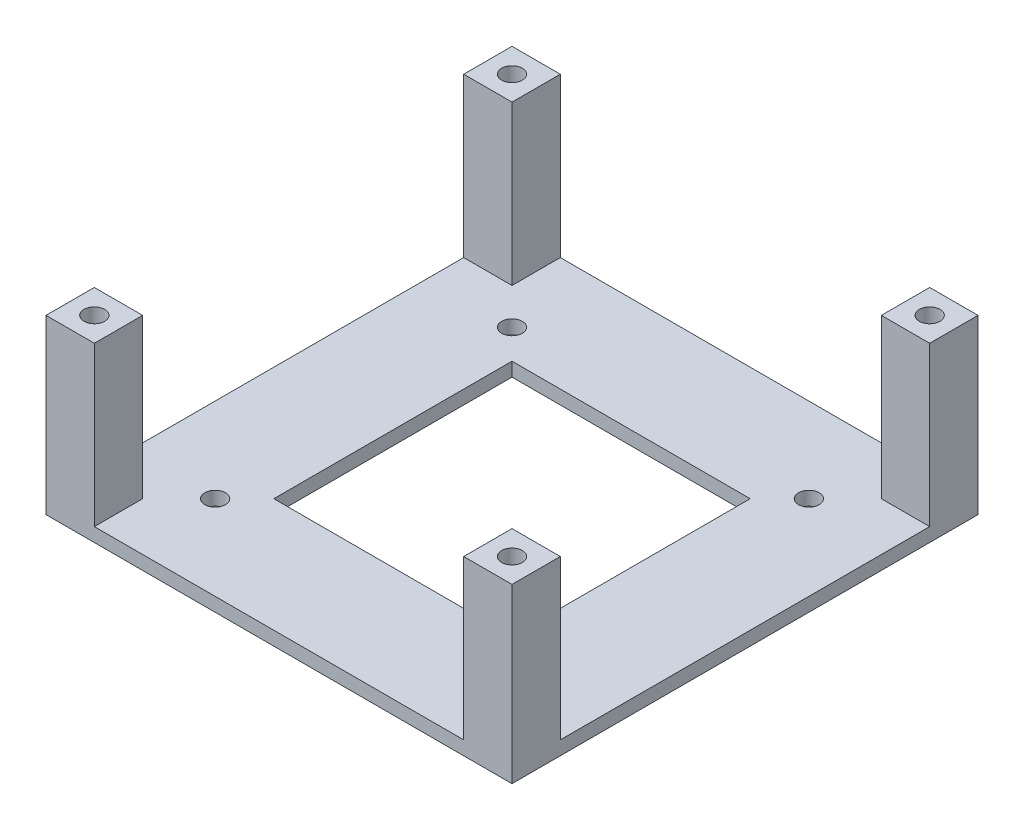
ISO-10303-21;
HEADER;
FILE_DESCRIPTION(('STEP AP214'),'2;1');
FILE_NAME('part.step','',(''),(''),'','','');
FILE_SCHEMA(('AUTOMOTIVE_DESIGN { 1 0 10303 214 1 1 1 1 }'));
ENDSEC;
DATA;
#1=APPLICATION_CONTEXT('core data for automotive mechanical design processes');
#2=APPLICATION_PROTOCOL_DEFINITION('international standard','automotive_design',2000,#1);
#3=PRODUCT_CONTEXT('',#1,'mechanical');
#4=PRODUCT('Part','Part','',(#3));
#5=PRODUCT_RELATED_PRODUCT_CATEGORY('part','',(#4));
#6=PRODUCT_DEFINITION_FORMATION('','',#4);
#7=PRODUCT_DEFINITION_CONTEXT('part definition',#1,'design');
#8=PRODUCT_DEFINITION('design','',#6,#7);
#9=PRODUCT_DEFINITION_SHAPE('','',#8);
#10=(LENGTH_UNIT() NAMED_UNIT(*) SI_UNIT(.MILLI.,.METRE.));
#11=(NAMED_UNIT(*) PLANE_ANGLE_UNIT() SI_UNIT($,.RADIAN.));
#12=(NAMED_UNIT(*) SI_UNIT($,.STERADIAN.) SOLID_ANGLE_UNIT());
#13=UNCERTAINTY_MEASURE_WITH_UNIT(LENGTH_MEASURE(1.E-05),#10,'distance_accuracy_value','');
#14=(GEOMETRIC_REPRESENTATION_CONTEXT(3) GLOBAL_UNCERTAINTY_ASSIGNED_CONTEXT((#13)) GLOBAL_UNIT_ASSIGNED_CONTEXT((#10,
#11,#12)) REPRESENTATION_CONTEXT('',''));
#15=CARTESIAN_POINT('',(0.,0.,0.));
#16=DIRECTION('',(0.,0.,1.));
#17=DIRECTION('',(1.,0.,0.));
#18=AXIS2_PLACEMENT_3D('',#15,#16,#17);
#19=CARTESIAN_POINT('',(17.25,2.,0.));
#20=DIRECTION('',(-1.,0.,0.));
#21=DIRECTION('',(0.,0.,1.));
#22=AXIS2_PLACEMENT_3D('',#19,#20,#21);
#23=PLANE('',#22);
#24=DIRECTION('',(0.,0.,-1.));
#25=VECTOR('',#24,1.);
#26=CARTESIAN_POINT('',(17.25,0.,0.));
#27=LINE('',#26,#25);
#28=CARTESIAN_POINT('',(17.25,0.,17.25));
#29=VERTEX_POINT('',#28);
#30=CARTESIAN_POINT('',(17.25,0.,-17.25));
#31=VERTEX_POINT('',#30);
#32=EDGE_CURVE('E358',#29,#31,#27,.T.);
#33=ORIENTED_EDGE('',*,*,#32,.F.);
#34=DIRECTION('',(0.,-1.,0.));
#35=VECTOR('',#34,1.);
#36=CARTESIAN_POINT('',(17.25,2.,17.25));
#37=LINE('',#36,#35);
#38=CARTESIAN_POINT('',(17.25,2.,17.25));
#39=VERTEX_POINT('',#38);
#40=EDGE_CURVE('E11',#39,#29,#37,.T.);
#41=ORIENTED_EDGE('',*,*,#40,.F.);
#42=DIRECTION('',(0.,0.,-1.));
#43=VECTOR('',#42,1.);
#44=CARTESIAN_POINT('',(17.25,2.,0.));
#45=LINE('',#44,#43);
#46=CARTESIAN_POINT('',(17.25,2.,-17.25));
#47=VERTEX_POINT('',#46);
#48=EDGE_CURVE('E335',#39,#47,#45,.T.);
#49=ORIENTED_EDGE('',*,*,#48,.T.);
#50=DIRECTION('',(0.,-1.,0.));
#51=VECTOR('',#50,1.);
#52=CARTESIAN_POINT('',(17.25,2.,-17.25));
#53=LINE('',#52,#51);
#54=EDGE_CURVE('E352',#47,#31,#53,.T.);
#55=ORIENTED_EDGE('',*,*,#54,.T.);
#56=EDGE_LOOP('',(#33,#41,#49,#55));
#57=FACE_BOUND('',#56,.T.);
#58=ADVANCED_FACE('F34',(#57),#23,.T.);
#59=CARTESIAN_POINT('',(0.,2.,17.25));
#60=DIRECTION('',(0.,0.,-1.));
#61=DIRECTION('',(-1.,0.,0.));
#62=AXIS2_PLACEMENT_3D('',#59,#60,#61);
#63=PLANE('',#62);
#64=DIRECTION('',(1.,0.,0.));
#65=VECTOR('',#64,1.);
#66=CARTESIAN_POINT('',(0.,0.,17.25));
#67=LINE('',#66,#65);
#68=CARTESIAN_POINT('',(-17.25,0.,17.25));
#69=VERTEX_POINT('',#68);
#70=EDGE_CURVE('E361',#69,#29,#67,.T.);
#71=ORIENTED_EDGE('',*,*,#70,.F.);
#72=DIRECTION('',(0.,-1.,0.));
#73=VECTOR('',#72,1.);
#74=CARTESIAN_POINT('',(-17.25,2.,17.25));
#75=LINE('',#74,#73);
#76=CARTESIAN_POINT('',(-17.25,2.,17.25));
#77=VERTEX_POINT('',#76);
#78=EDGE_CURVE('E42',#77,#69,#75,.T.);
#79=ORIENTED_EDGE('',*,*,#78,.F.);
#80=DIRECTION('',(1.,0.,0.));
#81=VECTOR('',#80,1.);
#82=CARTESIAN_POINT('',(0.,2.,17.25));
#83=LINE('',#82,#81);
#84=EDGE_CURVE('E338',#77,#39,#83,.T.);
#85=ORIENTED_EDGE('',*,*,#84,.T.);
#86=ORIENTED_EDGE('',*,*,#40,.T.);
#87=EDGE_LOOP('',(#71,#79,#85,#86));
#88=FACE_BOUND('',#87,.T.);
#89=ADVANCED_FACE('F389',(#88),#63,.T.);
#90=CARTESIAN_POINT('',(-17.25,2.,0.));
#91=DIRECTION('',(-1.,0.,0.));
#92=DIRECTION('',(0.,0.,1.));
#93=AXIS2_PLACEMENT_3D('',#90,#91,#92);
#94=PLANE('',#93);
#95=DIRECTION('',(0.,0.,-1.));
#96=VECTOR('',#95,1.);
#97=CARTESIAN_POINT('',(-17.25,0.,0.));
#98=LINE('',#97,#96);
#99=CARTESIAN_POINT('',(-17.25,0.,-17.25));
#100=VERTEX_POINT('',#99);
#101=EDGE_CURVE('E364',#69,#100,#98,.T.);
#102=ORIENTED_EDGE('',*,*,#101,.T.);
#103=DIRECTION('',(0.,-1.,0.));
#104=VECTOR('',#103,1.);
#105=CARTESIAN_POINT('',(-17.25,2.,-17.25));
#106=LINE('',#105,#104);
#107=CARTESIAN_POINT('',(-17.25,2.,-17.25));
#108=VERTEX_POINT('',#107);
#109=EDGE_CURVE('E376',#108,#100,#106,.T.);
#110=ORIENTED_EDGE('',*,*,#109,.F.);
#111=DIRECTION('',(0.,0.,-1.));
#112=VECTOR('',#111,1.);
#113=CARTESIAN_POINT('',(-17.25,2.,0.));
#114=LINE('',#113,#112);
#115=EDGE_CURVE('E341',#77,#108,#114,.T.);
#116=ORIENTED_EDGE('',*,*,#115,.F.);
#117=ORIENTED_EDGE('',*,*,#78,.T.);
#118=EDGE_LOOP('',(#102,#110,#116,#117));
#119=FACE_BOUND('',#118,.T.);
#120=ADVANCED_FACE('F381',(#119),#94,.F.);
#121=CARTESIAN_POINT('',(21.5,2.,-21.5));
#122=DIRECTION('',(0.,-1.,0.));
#123=DIRECTION('',(0.,0.,-1.));
#124=AXIS2_PLACEMENT_3D('',#121,#122,#123);
#125=CYLINDRICAL_SURFACE('',#124,1.5);
#126=CARTESIAN_POINT('',(21.5,2.,-21.5));
#127=DIRECTION('',(0.,1.,0.));
#128=DIRECTION('',(0.,0.,1.));
#129=AXIS2_PLACEMENT_3D('',#126,#127,#128);
#130=CIRCLE('',#129,1.5);
#131=CARTESIAN_POINT('',(21.5,2.,-20.));
#132=VERTEX_POINT('',#131);
#133=EDGE_CURVE('E346',#132,#132,#130,.T.);
#134=ORIENTED_EDGE('',*,*,#133,.T.);
#135=EDGE_LOOP('',(#134));
#136=FACE_BOUND('',#135,.T.);
#137=CARTESIAN_POINT('',(21.5,0.,-21.5));
#138=DIRECTION('',(0.,1.,0.));
#139=DIRECTION('',(0.,0.,1.));
#140=AXIS2_PLACEMENT_3D('',#137,#138,#139);
#141=CIRCLE('',#140,1.5);
#142=CARTESIAN_POINT('',(21.5,0.,-20.));
#143=VERTEX_POINT('',#142);
#144=EDGE_CURVE('E370',#143,#143,#141,.T.);
#145=ORIENTED_EDGE('',*,*,#144,.F.);
#146=EDGE_LOOP('',(#145));
#147=FACE_BOUND('',#146,.T.);
#148=ADVANCED_FACE('F457',(#136,#147),#125,.F.);
#149=CARTESIAN_POINT('',(0.,2.,-17.25));
#150=DIRECTION('',(0.,0.,-1.));
#151=DIRECTION('',(-1.,0.,0.));
#152=AXIS2_PLACEMENT_3D('',#149,#150,#151);
#153=PLANE('',#152);
#154=DIRECTION('',(1.,0.,0.));
#155=VECTOR('',#154,1.);
#156=CARTESIAN_POINT('',(0.,0.,-17.25));
#157=LINE('',#156,#155);
#158=EDGE_CURVE('E367',#100,#31,#157,.T.);
#159=ORIENTED_EDGE('',*,*,#158,.T.);
#160=ORIENTED_EDGE('',*,*,#54,.F.);
#161=DIRECTION('',(1.,0.,0.));
#162=VECTOR('',#161,1.);
#163=CARTESIAN_POINT('',(0.,2.,-17.25));
#164=LINE('',#163,#162);
#165=EDGE_CURVE('E344',#108,#47,#164,.T.);
#166=ORIENTED_EDGE('',*,*,#165,.F.);
#167=ORIENTED_EDGE('',*,*,#109,.T.);
#168=EDGE_LOOP('',(#159,#160,#166,#167));
#169=FACE_BOUND('',#168,.T.);
#170=ADVANCED_FACE('F395',(#169),#153,.F.);
#171=CARTESIAN_POINT('',(-21.5,2.,21.5));
#172=DIRECTION('',(0.,-1.,0.));
#173=DIRECTION('',(0.,0.,-1.));
#174=AXIS2_PLACEMENT_3D('',#171,#172,#173);
#175=CYLINDRICAL_SURFACE('',#174,1.5);
#176=CARTESIAN_POINT('',(-21.5,2.,21.5));
#177=DIRECTION('',(0.,1.,0.));
#178=DIRECTION('',(0.,0.,1.));
#179=AXIS2_PLACEMENT_3D('',#176,#177,#178);
#180=CIRCLE('',#179,1.5);
#181=CARTESIAN_POINT('',(-21.5,2.,23.));
#182=VERTEX_POINT('',#181);
#183=EDGE_CURVE('E331',#182,#182,#180,.T.);
#184=ORIENTED_EDGE('',*,*,#183,.T.);
#185=EDGE_LOOP('',(#184));
#186=FACE_BOUND('',#185,.T.);
#187=CARTESIAN_POINT('',(-21.5,0.,21.5));
#188=DIRECTION('',(0.,1.,0.));
#189=DIRECTION('',(0.,0.,1.));
#190=AXIS2_PLACEMENT_3D('',#187,#188,#189);
#191=CIRCLE('',#190,1.5);
#192=CARTESIAN_POINT('',(-21.5,0.,23.));
#193=VERTEX_POINT('',#192);
#194=EDGE_CURVE('E355',#193,#193,#191,.T.);
#195=ORIENTED_EDGE('',*,*,#194,.F.);
#196=EDGE_LOOP('',(#195));
#197=FACE_BOUND('',#196,.T.);
#198=ADVANCED_FACE('F449',(#186,#197),#175,.F.);
#199=CARTESIAN_POINT('',(21.5,2.,21.5));
#200=DIRECTION('',(0.,-1.,0.));
#201=DIRECTION('',(0.,0.,-1.));
#202=AXIS2_PLACEMENT_3D('',#199,#200,#201);
#203=CYLINDRICAL_SURFACE('',#202,1.5);
#204=CARTESIAN_POINT('',(21.5,2.,21.5));
#205=DIRECTION('',(0.,1.,0.));
#206=DIRECTION('',(0.,0.,1.));
#207=AXIS2_PLACEMENT_3D('',#204,#205,#206);
#208=CIRCLE('',#207,1.5);
#209=CARTESIAN_POINT('',(21.5,2.,23.));
#210=VERTEX_POINT('',#209);
#211=EDGE_CURVE('E328',#210,#210,#208,.F.);
#212=ORIENTED_EDGE('',*,*,#211,.F.);
#213=EDGE_LOOP('',(#212));
#214=FACE_BOUND('',#213,.T.);
#215=CARTESIAN_POINT('',(21.5,0.,21.5));
#216=DIRECTION('',(0.,1.,0.));
#217=DIRECTION('',(0.,0.,1.));
#218=AXIS2_PLACEMENT_3D('',#215,#216,#217);
#219=CIRCLE('',#218,1.5);
#220=CARTESIAN_POINT('',(21.5,0.,23.));
#221=VERTEX_POINT('',#220);
#222=EDGE_CURVE('E327',#221,#221,#219,.F.);
#223=ORIENTED_EDGE('',*,*,#222,.T.);
#224=EDGE_LOOP('',(#223));
#225=FACE_BOUND('',#224,.T.);
#226=ADVANCED_FACE('F36',(#214,#225),#203,.F.);
#227=CARTESIAN_POINT('',(-21.5,2.,-21.5));
#228=DIRECTION('',(0.,-1.,0.));
#229=DIRECTION('',(0.,0.,-1.));
#230=AXIS2_PLACEMENT_3D('',#227,#228,#229);
#231=CYLINDRICAL_SURFACE('',#230,1.5);
#232=CARTESIAN_POINT('',(-21.5,2.,-21.5));
#233=DIRECTION('',(0.,1.,0.));
#234=DIRECTION('',(0.,0.,1.));
#235=AXIS2_PLACEMENT_3D('',#232,#233,#234);
#236=CIRCLE('',#235,1.5);
#237=CARTESIAN_POINT('',(-21.5,2.,-20.));
#238=VERTEX_POINT('',#237);
#239=EDGE_CURVE('E349',#238,#238,#236,.F.);
#240=ORIENTED_EDGE('',*,*,#239,.F.);
#241=EDGE_LOOP('',(#240));
#242=FACE_BOUND('',#241,.T.);
#243=CARTESIAN_POINT('',(-21.5,0.,-21.5));
#244=DIRECTION('',(0.,1.,0.));
#245=DIRECTION('',(0.,0.,1.));
#246=AXIS2_PLACEMENT_3D('',#243,#244,#245);
#247=CIRCLE('',#246,1.5);
#248=CARTESIAN_POINT('',(-21.5,0.,-20.));
#249=VERTEX_POINT('',#248);
#250=EDGE_CURVE('E332',#249,#249,#247,.F.);
#251=ORIENTED_EDGE('',*,*,#250,.T.);
#252=EDGE_LOOP('',(#251));
#253=FACE_BOUND('',#252,.T.);
#254=ADVANCED_FACE('F400',(#242,#253),#231,.F.);
#255=CARTESIAN_POINT('',(0.,2.,0.));
#256=DIRECTION('',(0.,1.,0.));
#257=DIRECTION('',(0.,0.,1.));
#258=AXIS2_PLACEMENT_3D('',#255,#256,#257);
#259=PLANE('',#258);
#260=DIRECTION('',(1.,0.,0.));
#261=VECTOR('',#260,1.);
#262=CARTESIAN_POINT('',(0.,2.,-26.75));
#263=LINE('',#262,#261);
#264=CARTESIAN_POINT('',(-33.75,2.,-26.75));
#265=VERTEX_POINT('',#264);
#266=CARTESIAN_POINT('',(-26.75,2.,-26.75));
#267=VERTEX_POINT('',#266);
#268=EDGE_CURVE('E176',#265,#267,#263,.T.);
#269=ORIENTED_EDGE('',*,*,#268,.F.);
#270=DIRECTION('',(0.,0.,1.));
#271=VECTOR('',#270,1.);
#272=CARTESIAN_POINT('',(-33.75,2.,33.75));
#273=LINE('',#272,#271);
#274=CARTESIAN_POINT('',(-33.75,2.,26.75));
#275=VERTEX_POINT('',#274);
#276=EDGE_CURVE('E301',#265,#275,#273,.T.);
#277=ORIENTED_EDGE('',*,*,#276,.T.);
#278=DIRECTION('',(1.,0.,0.));
#279=VECTOR('',#278,1.);
#280=CARTESIAN_POINT('',(0.,2.,26.75));
#281=LINE('',#280,#279);
#282=CARTESIAN_POINT('',(-26.75,2.,26.75));
#283=VERTEX_POINT('',#282);
#284=EDGE_CURVE('E286',#275,#283,#281,.T.);
#285=ORIENTED_EDGE('',*,*,#284,.T.);
#286=DIRECTION('',(0.,0.,-1.));
#287=VECTOR('',#286,1.);
#288=CARTESIAN_POINT('',(-26.75,2.,0.));
#289=LINE('',#288,#287);
#290=CARTESIAN_POINT('',(-26.75,2.,33.75));
#291=VERTEX_POINT('',#290);
#292=EDGE_CURVE('E283',#291,#283,#289,.T.);
#293=ORIENTED_EDGE('',*,*,#292,.F.);
#294=DIRECTION('',(1.,0.,0.));
#295=VECTOR('',#294,1.);
#296=CARTESIAN_POINT('',(33.75,2.,33.75));
#297=LINE('',#296,#295);
#298=CARTESIAN_POINT('',(26.75,2.,33.75));
#299=VERTEX_POINT('',#298);
#300=EDGE_CURVE('E303',#291,#299,#297,.T.);
#301=ORIENTED_EDGE('',*,*,#300,.T.);
#302=DIRECTION('',(0.,0.,-1.));
#303=VECTOR('',#302,1.);
#304=CARTESIAN_POINT('',(26.75,2.,0.));
#305=LINE('',#304,#303);
#306=CARTESIAN_POINT('',(26.75,2.,26.75));
#307=VERTEX_POINT('',#306);
#308=EDGE_CURVE('E259',#299,#307,#305,.T.);
#309=ORIENTED_EDGE('',*,*,#308,.T.);
#310=DIRECTION('',(-1.,0.,0.));
#311=VECTOR('',#310,1.);
#312=CARTESIAN_POINT('',(0.,2.,26.75));
#313=LINE('',#312,#311);
#314=CARTESIAN_POINT('',(33.75,2.,26.75));
#315=VERTEX_POINT('',#314);
#316=EDGE_CURVE('E256',#315,#307,#313,.T.);
#317=ORIENTED_EDGE('',*,*,#316,.F.);
#318=DIRECTION('',(0.,0.,-1.));
#319=VECTOR('',#318,1.);
#320=CARTESIAN_POINT('',(33.75,2.,33.75));
#321=LINE('',#320,#319);
#322=CARTESIAN_POINT('',(33.75,2.,-26.75));
#323=VERTEX_POINT('',#322);
#324=EDGE_CURVE('E306',#315,#323,#321,.T.);
#325=ORIENTED_EDGE('',*,*,#324,.T.);
#326=DIRECTION('',(-1.,0.,0.));
#327=VECTOR('',#326,1.);
#328=CARTESIAN_POINT('',(0.,2.,-26.75));
#329=LINE('',#328,#327);
#330=CARTESIAN_POINT('',(26.75,2.,-26.75));
#331=VERTEX_POINT('',#330);
#332=EDGE_CURVE('E231',#323,#331,#329,.T.);
#333=ORIENTED_EDGE('',*,*,#332,.T.);
#334=DIRECTION('',(0.,0.,1.));
#335=VECTOR('',#334,1.);
#336=CARTESIAN_POINT('',(26.75,2.,0.));
#337=LINE('',#336,#335);
#338=CARTESIAN_POINT('',(26.75,2.,-33.75));
#339=VERTEX_POINT('',#338);
#340=EDGE_CURVE('E228',#339,#331,#337,.T.);
#341=ORIENTED_EDGE('',*,*,#340,.F.);
#342=DIRECTION('',(-1.,0.,0.));
#343=VECTOR('',#342,1.);
#344=CARTESIAN_POINT('',(33.75,2.,-33.75));
#345=LINE('',#344,#343);
#346=CARTESIAN_POINT('',(-26.75,2.,-33.75));
#347=VERTEX_POINT('',#346);
#348=EDGE_CURVE('E54',#339,#347,#345,.T.);
#349=ORIENTED_EDGE('',*,*,#348,.T.);
#350=DIRECTION('',(0.,0.,1.));
#351=VECTOR('',#350,1.);
#352=CARTESIAN_POINT('',(-26.75,2.,0.));
#353=LINE('',#352,#351);
#354=EDGE_CURVE('E49',#347,#267,#353,.T.);
#355=ORIENTED_EDGE('',*,*,#354,.T.);
#356=EDGE_LOOP('',(#269,#277,#285,#293,#301,#309,#317,#325,#333,#341,#349,#355));
#357=FACE_BOUND('',#356,.T.);
#358=ORIENTED_EDGE('',*,*,#211,.T.);
#359=EDGE_LOOP('',(#358));
#360=FACE_BOUND('',#359,.T.);
#361=ORIENTED_EDGE('',*,*,#183,.F.);
#362=EDGE_LOOP('',(#361));
#363=FACE_BOUND('',#362,.T.);
#364=ORIENTED_EDGE('',*,*,#48,.F.);
#365=ORIENTED_EDGE('',*,*,#84,.F.);
#366=ORIENTED_EDGE('',*,*,#115,.T.);
#367=ORIENTED_EDGE('',*,*,#165,.T.);
#368=EDGE_LOOP('',(#364,#365,#366,#367));
#369=FACE_BOUND('',#368,.T.);
#370=ORIENTED_EDGE('',*,*,#133,.F.);
#371=EDGE_LOOP('',(#370));
#372=FACE_BOUND('',#371,.T.);
#373=ORIENTED_EDGE('',*,*,#239,.T.);
#374=EDGE_LOOP('',(#373));
#375=FACE_BOUND('',#374,.T.);
#376=ADVANCED_FACE('F397',(#357,#360,#363,#369,#372,#375),#259,.T.);
#377=CARTESIAN_POINT('',(0.,0.,0.));
#378=DIRECTION('',(0.,1.,0.));
#379=DIRECTION('',(0.,0.,1.));
#380=AXIS2_PLACEMENT_3D('',#377,#378,#379);
#381=PLANE('',#380);
#382=ORIENTED_EDGE('',*,*,#222,.F.);
#383=EDGE_LOOP('',(#382));
#384=FACE_BOUND('',#383,.T.);
#385=ORIENTED_EDGE('',*,*,#194,.T.);
#386=EDGE_LOOP('',(#385));
#387=FACE_BOUND('',#386,.T.);
#388=ORIENTED_EDGE('',*,*,#32,.T.);
#389=ORIENTED_EDGE('',*,*,#158,.F.);
#390=ORIENTED_EDGE('',*,*,#101,.F.);
#391=ORIENTED_EDGE('',*,*,#70,.T.);
#392=EDGE_LOOP('',(#388,#389,#390,#391));
#393=FACE_BOUND('',#392,.T.);
#394=ORIENTED_EDGE('',*,*,#144,.T.);
#395=EDGE_LOOP('',(#394));
#396=FACE_BOUND('',#395,.T.);
#397=ORIENTED_EDGE('',*,*,#250,.F.);
#398=EDGE_LOOP('',(#397));
#399=FACE_BOUND('',#398,.T.);
#400=DIRECTION('',(1.,0.,0.));
#401=VECTOR('',#400,1.);
#402=CARTESIAN_POINT('',(33.75,0.,33.75));
#403=LINE('',#402,#401);
#404=CARTESIAN_POINT('',(-33.75,0.,33.75));
#405=VERTEX_POINT('',#404);
#406=CARTESIAN_POINT('',(33.75,0.,33.75));
#407=VERTEX_POINT('',#406);
#408=EDGE_CURVE('E311',#405,#407,#403,.T.);
#409=ORIENTED_EDGE('',*,*,#408,.F.);
#410=DIRECTION('',(0.,0.,1.));
#411=VECTOR('',#410,1.);
#412=CARTESIAN_POINT('',(-33.75,0.,33.75));
#413=LINE('',#412,#411);
#414=CARTESIAN_POINT('',(-33.75,0.,-33.75));
#415=VERTEX_POINT('',#414);
#416=EDGE_CURVE('E300',#415,#405,#413,.T.);
#417=ORIENTED_EDGE('',*,*,#416,.F.);
#418=DIRECTION('',(-1.,0.,0.));
#419=VECTOR('',#418,1.);
#420=CARTESIAN_POINT('',(33.75,0.,-33.75));
#421=LINE('',#420,#419);
#422=CARTESIAN_POINT('',(33.75,0.,-33.75));
#423=VERTEX_POINT('',#422);
#424=EDGE_CURVE('E304',#423,#415,#421,.T.);
#425=ORIENTED_EDGE('',*,*,#424,.F.);
#426=DIRECTION('',(0.,0.,-1.));
#427=VECTOR('',#426,1.);
#428=CARTESIAN_POINT('',(33.75,0.,33.75));
#429=LINE('',#428,#427);
#430=EDGE_CURVE('E313',#407,#423,#429,.T.);
#431=ORIENTED_EDGE('',*,*,#430,.F.);
#432=EDGE_LOOP('',(#409,#417,#425,#431));
#433=FACE_BOUND('',#432,.T.);
#434=CARTESIAN_POINT('',(-30.25,0.,30.25));
#435=DIRECTION('',(0.,1.,0.));
#436=DIRECTION('',(0.,0.,-1.));
#437=AXIS2_PLACEMENT_3D('',#434,#435,#436);
#438=CIRCLE('',#437,1.5);
#439=CARTESIAN_POINT('',(-30.25,0.,28.75));
#440=VERTEX_POINT('',#439);
#441=EDGE_CURVE('E288',#440,#440,#438,.T.);
#442=ORIENTED_EDGE('',*,*,#441,.T.);
#443=EDGE_LOOP('',(#442));
#444=FACE_BOUND('',#443,.T.);
#445=CARTESIAN_POINT('',(30.25,0.,30.25));
#446=DIRECTION('',(0.,1.,0.));
#447=DIRECTION('',(0.,0.,1.));
#448=AXIS2_PLACEMENT_3D('',#445,#446,#447);
#449=CIRCLE('',#448,1.5);
#450=CARTESIAN_POINT('',(30.25,0.,31.75));
#451=VERTEX_POINT('',#450);
#452=EDGE_CURVE('E291',#451,#451,#449,.T.);
#453=ORIENTED_EDGE('',*,*,#452,.T.);
#454=EDGE_LOOP('',(#453));
#455=FACE_BOUND('',#454,.T.);
#456=CARTESIAN_POINT('',(30.25,0.,-30.25));
#457=DIRECTION('',(0.,1.,0.));
#458=DIRECTION('',(0.,0.,-1.));
#459=AXIS2_PLACEMENT_3D('',#456,#457,#458);
#460=CIRCLE('',#459,1.5);
#461=CARTESIAN_POINT('',(30.25,0.,-31.75));
#462=VERTEX_POINT('',#461);
#463=EDGE_CURVE('E294',#462,#462,#460,.T.);
#464=ORIENTED_EDGE('',*,*,#463,.T.);
#465=EDGE_LOOP('',(#464));
#466=FACE_BOUND('',#465,.T.);
#467=CARTESIAN_POINT('',(-30.25,0.,-30.25));
#468=DIRECTION('',(0.,1.,0.));
#469=DIRECTION('',(0.,0.,1.));
#470=AXIS2_PLACEMENT_3D('',#467,#468,#469);
#471=CIRCLE('',#470,1.5);
#472=CARTESIAN_POINT('',(-30.25,0.,-28.75));
#473=VERTEX_POINT('',#472);
#474=EDGE_CURVE('E297',#473,#473,#471,.T.);
#475=ORIENTED_EDGE('',*,*,#474,.T.);
#476=EDGE_LOOP('',(#475));
#477=FACE_BOUND('',#476,.T.);
#478=ADVANCED_FACE('F387',(#384,#387,#393,#396,#399,#433,#444,#455,#466,#477),#381,.F.);
#479=CARTESIAN_POINT('',(-33.75,2.,33.75));
#480=DIRECTION('',(1.,0.,0.));
#481=DIRECTION('',(0.,0.,-1.));
#482=AXIS2_PLACEMENT_3D('',#479,#480,#481);
#483=PLANE('',#482);
#484=ORIENTED_EDGE('',*,*,#276,.F.);
#485=DIRECTION('',(0.,-1.,0.));
#486=VECTOR('',#485,1.);
#487=CARTESIAN_POINT('',(-33.75,25.,-26.75));
#488=LINE('',#487,#486);
#489=CARTESIAN_POINT('',(-33.75,25.,-26.75));
#490=VERTEX_POINT('',#489);
#491=EDGE_CURVE('E199',#490,#265,#488,.T.);
#492=ORIENTED_EDGE('',*,*,#491,.F.);
#493=DIRECTION('',(0.,0.,-1.));
#494=VECTOR('',#493,1.);
#495=CARTESIAN_POINT('',(-33.75,25.,0.));
#496=LINE('',#495,#494);
#497=CARTESIAN_POINT('',(-33.75,25.,-33.75));
#498=VERTEX_POINT('',#497);
#499=EDGE_CURVE('E191',#490,#498,#496,.T.);
#500=ORIENTED_EDGE('',*,*,#499,.T.);
#501=DIRECTION('',(0.,-1.,0.));
#502=VECTOR('',#501,1.);
#503=CARTESIAN_POINT('',(-33.75,2.,-33.75));
#504=LINE('',#503,#502);
#505=EDGE_CURVE('E309',#498,#415,#504,.T.);
#506=ORIENTED_EDGE('',*,*,#505,.T.);
#507=ORIENTED_EDGE('',*,*,#416,.T.);
#508=DIRECTION('',(0.,-1.,0.));
#509=VECTOR('',#508,1.);
#510=CARTESIAN_POINT('',(-33.75,2.,33.75));
#511=LINE('',#510,#509);
#512=CARTESIAN_POINT('',(-33.75,25.,33.75));
#513=VERTEX_POINT('',#512);
#514=EDGE_CURVE('E324',#513,#405,#511,.T.);
#515=ORIENTED_EDGE('',*,*,#514,.F.);
#516=DIRECTION('',(0.,0.,-1.));
#517=VECTOR('',#516,1.);
#518=CARTESIAN_POINT('',(-33.75,25.,0.));
#519=LINE('',#518,#517);
#520=CARTESIAN_POINT('',(-33.75,25.,26.75));
#521=VERTEX_POINT('',#520);
#522=EDGE_CURVE('E269',#513,#521,#519,.T.);
#523=ORIENTED_EDGE('',*,*,#522,.T.);
#524=DIRECTION('',(0.,-1.,0.));
#525=VECTOR('',#524,1.);
#526=CARTESIAN_POINT('',(-33.75,25.,26.75));
#527=LINE('',#526,#525);
#528=EDGE_CURVE('E277',#521,#275,#527,.T.);
#529=ORIENTED_EDGE('',*,*,#528,.T.);
#530=EDGE_LOOP('',(#484,#492,#500,#506,#507,#515,#523,#529));
#531=FACE_BOUND('',#530,.T.);
#532=ADVANCED_FACE('F413',(#531),#483,.F.);
#533=CARTESIAN_POINT('',(33.75,2.,33.75));
#534=DIRECTION('',(0.,0.,-1.));
#535=DIRECTION('',(-1.,0.,0.));
#536=AXIS2_PLACEMENT_3D('',#533,#534,#535);
#537=PLANE('',#536);
#538=DIRECTION('',(0.,-1.,0.));
#539=VECTOR('',#538,1.);
#540=CARTESIAN_POINT('',(33.75,2.,33.75));
#541=LINE('',#540,#539);
#542=CARTESIAN_POINT('',(33.75,25.,33.75));
#543=VERTEX_POINT('',#542);
#544=EDGE_CURVE('E321',#543,#407,#541,.T.);
#545=ORIENTED_EDGE('',*,*,#544,.F.);
#546=DIRECTION('',(1.,0.,0.));
#547=VECTOR('',#546,1.);
#548=CARTESIAN_POINT('',(0.,25.,33.75));
#549=LINE('',#548,#547);
#550=CARTESIAN_POINT('',(26.75,25.,33.75));
#551=VERTEX_POINT('',#550);
#552=EDGE_CURVE('E242',#551,#543,#549,.T.);
#553=ORIENTED_EDGE('',*,*,#552,.F.);
#554=DIRECTION('',(0.,-1.,0.));
#555=VECTOR('',#554,1.);
#556=CARTESIAN_POINT('',(26.75,25.,33.75));
#557=LINE('',#556,#555);
#558=EDGE_CURVE('E250',#551,#299,#557,.T.);
#559=ORIENTED_EDGE('',*,*,#558,.T.);
#560=ORIENTED_EDGE('',*,*,#300,.F.);
#561=DIRECTION('',(0.,-1.,0.));
#562=VECTOR('',#561,1.);
#563=CARTESIAN_POINT('',(-26.75,25.,33.75));
#564=LINE('',#563,#562);
#565=CARTESIAN_POINT('',(-26.75,25.,33.75));
#566=VERTEX_POINT('',#565);
#567=EDGE_CURVE('E274',#566,#291,#564,.T.);
#568=ORIENTED_EDGE('',*,*,#567,.F.);
#569=DIRECTION('',(1.,0.,0.));
#570=VECTOR('',#569,1.);
#571=CARTESIAN_POINT('',(0.,25.,33.75));
#572=LINE('',#571,#570);
#573=EDGE_CURVE('E272',#513,#566,#572,.T.);
#574=ORIENTED_EDGE('',*,*,#573,.F.);
#575=ORIENTED_EDGE('',*,*,#514,.T.);
#576=ORIENTED_EDGE('',*,*,#408,.T.);
#577=EDGE_LOOP('',(#545,#553,#559,#560,#568,#574,#575,#576));
#578=FACE_BOUND('',#577,.T.);
#579=ADVANCED_FACE('F522',(#578),#537,.F.);
#580=CARTESIAN_POINT('',(33.75,2.,33.75));
#581=DIRECTION('',(-1.,0.,0.));
#582=DIRECTION('',(0.,0.,1.));
#583=AXIS2_PLACEMENT_3D('',#580,#581,#582);
#584=PLANE('',#583);
#585=DIRECTION('',(0.,-1.,0.));
#586=VECTOR('',#585,1.);
#587=CARTESIAN_POINT('',(33.75,2.,-33.75));
#588=LINE('',#587,#586);
#589=CARTESIAN_POINT('',(33.75,25.,-33.75));
#590=VERTEX_POINT('',#589);
#591=EDGE_CURVE('E318',#590,#423,#588,.T.);
#592=ORIENTED_EDGE('',*,*,#591,.F.);
#593=DIRECTION('',(0.,0.,-1.));
#594=VECTOR('',#593,1.);
#595=CARTESIAN_POINT('',(33.75,25.,0.));
#596=LINE('',#595,#594);
#597=CARTESIAN_POINT('',(33.75,25.,-26.75));
#598=VERTEX_POINT('',#597);
#599=EDGE_CURVE('E213',#598,#590,#596,.T.);
#600=ORIENTED_EDGE('',*,*,#599,.F.);
#601=DIRECTION('',(0.,-1.,0.));
#602=VECTOR('',#601,1.);
#603=CARTESIAN_POINT('',(33.75,25.,-26.75));
#604=LINE('',#603,#602);
#605=EDGE_CURVE('E222',#598,#323,#604,.T.);
#606=ORIENTED_EDGE('',*,*,#605,.T.);
#607=ORIENTED_EDGE('',*,*,#324,.F.);
#608=DIRECTION('',(0.,-1.,0.));
#609=VECTOR('',#608,1.);
#610=CARTESIAN_POINT('',(33.75,25.,26.75));
#611=LINE('',#610,#609);
#612=CARTESIAN_POINT('',(33.75,25.,26.75));
#613=VERTEX_POINT('',#612);
#614=EDGE_CURVE('E247',#613,#315,#611,.T.);
#615=ORIENTED_EDGE('',*,*,#614,.F.);
#616=DIRECTION('',(0.,0.,-1.));
#617=VECTOR('',#616,1.);
#618=CARTESIAN_POINT('',(33.75,25.,0.));
#619=LINE('',#618,#617);
#620=EDGE_CURVE('E245',#543,#613,#619,.T.);
#621=ORIENTED_EDGE('',*,*,#620,.F.);
#622=ORIENTED_EDGE('',*,*,#544,.T.);
#623=ORIENTED_EDGE('',*,*,#430,.T.);
#624=EDGE_LOOP('',(#592,#600,#606,#607,#615,#621,#622,#623));
#625=FACE_BOUND('',#624,.T.);
#626=ADVANCED_FACE('F534',(#625),#584,.F.);
#627=CARTESIAN_POINT('',(33.75,2.,-33.75));
#628=DIRECTION('',(0.,0.,1.));
#629=DIRECTION('',(1.,0.,0.));
#630=AXIS2_PLACEMENT_3D('',#627,#628,#629);
#631=PLANE('',#630);
#632=ORIENTED_EDGE('',*,*,#505,.F.);
#633=DIRECTION('',(1.,0.,0.));
#634=VECTOR('',#633,1.);
#635=CARTESIAN_POINT('',(0.,25.,-33.75));
#636=LINE('',#635,#634);
#637=CARTESIAN_POINT('',(-26.75,25.,-33.75));
#638=VERTEX_POINT('',#637);
#639=EDGE_CURVE('E187',#498,#638,#636,.T.);
#640=ORIENTED_EDGE('',*,*,#639,.T.);
#641=DIRECTION('',(0.,-1.,0.));
#642=VECTOR('',#641,1.);
#643=CARTESIAN_POINT('',(-26.75,25.,-33.75));
#644=LINE('',#643,#642);
#645=EDGE_CURVE('E178',#638,#347,#644,.T.);
#646=ORIENTED_EDGE('',*,*,#645,.T.);
#647=ORIENTED_EDGE('',*,*,#348,.F.);
#648=DIRECTION('',(0.,-1.,0.));
#649=VECTOR('',#648,1.);
#650=CARTESIAN_POINT('',(26.75,25.,-33.75));
#651=LINE('',#650,#649);
#652=CARTESIAN_POINT('',(26.75,25.,-33.75));
#653=VERTEX_POINT('',#652);
#654=EDGE_CURVE('E219',#653,#339,#651,.T.);
#655=ORIENTED_EDGE('',*,*,#654,.F.);
#656=DIRECTION('',(1.,0.,0.));
#657=VECTOR('',#656,1.);
#658=CARTESIAN_POINT('',(0.,25.,-33.75));
#659=LINE('',#658,#657);
#660=EDGE_CURVE('E216',#653,#590,#659,.T.);
#661=ORIENTED_EDGE('',*,*,#660,.T.);
#662=ORIENTED_EDGE('',*,*,#591,.T.);
#663=ORIENTED_EDGE('',*,*,#424,.T.);
#664=EDGE_LOOP('',(#632,#640,#646,#647,#655,#661,#662,#663));
#665=FACE_BOUND('',#664,.T.);
#666=ADVANCED_FACE('F432',(#665),#631,.F.);
#667=CARTESIAN_POINT('',(-30.25,2.,-30.25));
#668=DIRECTION('',(0.,-1.,0.));
#669=DIRECTION('',(0.,0.,-1.));
#670=AXIS2_PLACEMENT_3D('',#667,#668,#669);
#671=CYLINDRICAL_SURFACE('',#670,1.5);
#672=ORIENTED_EDGE('',*,*,#474,.F.);
#673=EDGE_LOOP('',(#672));
#674=FACE_BOUND('',#673,.T.);
#675=CARTESIAN_POINT('',(-30.25,25.,-30.25));
#676=DIRECTION('',(0.,1.,0.));
#677=DIRECTION('',(0.,0.,1.));
#678=AXIS2_PLACEMENT_3D('',#675,#676,#677);
#679=CIRCLE('',#678,1.49999999999999);
#680=CARTESIAN_POINT('',(-30.25,25.,-28.75));
#681=VERTEX_POINT('',#680);
#682=EDGE_CURVE('E192',#681,#681,#679,.T.);
#683=ORIENTED_EDGE('',*,*,#682,.T.);
#684=EDGE_LOOP('',(#683));
#685=FACE_BOUND('',#684,.T.);
#686=ADVANCED_FACE('F428',(#674,#685),#671,.F.);
#687=CARTESIAN_POINT('',(30.25,2.,-30.25));
#688=DIRECTION('',(0.,-1.,0.));
#689=DIRECTION('',(0.,0.,-1.));
#690=AXIS2_PLACEMENT_3D('',#687,#688,#689);
#691=CYLINDRICAL_SURFACE('',#690,1.5);
#692=ORIENTED_EDGE('',*,*,#463,.F.);
#693=EDGE_LOOP('',(#692));
#694=FACE_BOUND('',#693,.T.);
#695=CARTESIAN_POINT('',(30.25,25.,-30.25));
#696=DIRECTION('',(0.,1.,0.));
#697=DIRECTION('',(0.,0.,1.));
#698=AXIS2_PLACEMENT_3D('',#695,#696,#697);
#699=CIRCLE('',#698,1.5);
#700=CARTESIAN_POINT('',(30.25,25.,-28.75));
#701=VERTEX_POINT('',#700);
#702=EDGE_CURVE('E204',#701,#701,#699,.T.);
#703=ORIENTED_EDGE('',*,*,#702,.T.);
#704=EDGE_LOOP('',(#703));
#705=FACE_BOUND('',#704,.T.);
#706=ADVANCED_FACE('F431',(#694,#705),#691,.F.);
#707=CARTESIAN_POINT('',(30.25,2.,30.25));
#708=DIRECTION('',(0.,-1.,0.));
#709=DIRECTION('',(0.,0.,-1.));
#710=AXIS2_PLACEMENT_3D('',#707,#708,#709);
#711=CYLINDRICAL_SURFACE('',#710,1.5);
#712=ORIENTED_EDGE('',*,*,#452,.F.);
#713=EDGE_LOOP('',(#712));
#714=FACE_BOUND('',#713,.T.);
#715=CARTESIAN_POINT('',(30.25,25.,30.25));
#716=DIRECTION('',(0.,1.,0.));
#717=DIRECTION('',(0.,0.,1.));
#718=AXIS2_PLACEMENT_3D('',#715,#716,#717);
#719=CIRCLE('',#718,1.5);
#720=CARTESIAN_POINT('',(30.25,25.,31.75));
#721=VERTEX_POINT('',#720);
#722=EDGE_CURVE('E233',#721,#721,#719,.T.);
#723=ORIENTED_EDGE('',*,*,#722,.T.);
#724=EDGE_LOOP('',(#723));
#725=FACE_BOUND('',#724,.T.);
#726=ADVANCED_FACE('F574',(#714,#725),#711,.F.);
#727=CARTESIAN_POINT('',(-30.25,2.,30.25));
#728=DIRECTION('',(0.,-1.,0.));
#729=DIRECTION('',(0.,0.,-1.));
#730=AXIS2_PLACEMENT_3D('',#727,#728,#729);
#731=CYLINDRICAL_SURFACE('',#730,1.5);
#732=ORIENTED_EDGE('',*,*,#441,.F.);
#733=EDGE_LOOP('',(#732));
#734=FACE_BOUND('',#733,.T.);
#735=CARTESIAN_POINT('',(-30.25,25.,30.25));
#736=DIRECTION('',(0.,1.,0.));
#737=DIRECTION('',(0.,0.,1.));
#738=AXIS2_PLACEMENT_3D('',#735,#736,#737);
#739=CIRCLE('',#738,1.5);
#740=CARTESIAN_POINT('',(-30.25,25.,31.75));
#741=VERTEX_POINT('',#740);
#742=EDGE_CURVE('E261',#741,#741,#739,.T.);
#743=ORIENTED_EDGE('',*,*,#742,.T.);
#744=EDGE_LOOP('',(#743));
#745=FACE_BOUND('',#744,.T.);
#746=ADVANCED_FACE('F585',(#734,#745),#731,.F.);
#747=CARTESIAN_POINT('',(-26.75,25.,0.));
#748=DIRECTION('',(1.,0.,0.));
#749=DIRECTION('',(0.,0.,-1.));
#750=AXIS2_PLACEMENT_3D('',#747,#748,#749);
#751=PLANE('',#750);
#752=ORIENTED_EDGE('',*,*,#567,.T.);
#753=ORIENTED_EDGE('',*,*,#292,.T.);
#754=DIRECTION('',(0.,-1.,0.));
#755=VECTOR('',#754,1.);
#756=CARTESIAN_POINT('',(-26.75,25.,26.75));
#757=LINE('',#756,#755);
#758=CARTESIAN_POINT('',(-26.75,25.,26.75));
#759=VERTEX_POINT('',#758);
#760=EDGE_CURVE('E280',#759,#283,#757,.T.);
#761=ORIENTED_EDGE('',*,*,#760,.F.);
#762=DIRECTION('',(0.,0.,1.));
#763=VECTOR('',#762,1.);
#764=CARTESIAN_POINT('',(-26.75,25.,0.));
#765=LINE('',#764,#763);
#766=EDGE_CURVE('E264',#759,#566,#765,.T.);
#767=ORIENTED_EDGE('',*,*,#766,.T.);
#768=EDGE_LOOP('',(#752,#753,#761,#767));
#769=FACE_BOUND('',#768,.T.);
#770=ADVANCED_FACE('F596',(#769),#751,.T.);
#771=CARTESIAN_POINT('',(0.,25.,26.75));
#772=DIRECTION('',(0.,0.,1.));
#773=DIRECTION('',(1.,0.,0.));
#774=AXIS2_PLACEMENT_3D('',#771,#772,#773);
#775=PLANE('',#774);
#776=ORIENTED_EDGE('',*,*,#284,.F.);
#777=ORIENTED_EDGE('',*,*,#528,.F.);
#778=DIRECTION('',(-1.,0.,0.));
#779=VECTOR('',#778,1.);
#780=CARTESIAN_POINT('',(0.,25.,26.75));
#781=LINE('',#780,#779);
#782=EDGE_CURVE('E267',#759,#521,#781,.T.);
#783=ORIENTED_EDGE('',*,*,#782,.F.);
#784=ORIENTED_EDGE('',*,*,#760,.T.);
#785=EDGE_LOOP('',(#776,#777,#783,#784));
#786=FACE_BOUND('',#785,.T.);
#787=ADVANCED_FACE('F607',(#786),#775,.F.);
#788=CARTESIAN_POINT('',(0.,25.,0.));
#789=DIRECTION('',(0.,1.,0.));
#790=DIRECTION('',(0.,0.,1.));
#791=AXIS2_PLACEMENT_3D('',#788,#789,#790);
#792=PLANE('',#791);
#793=ORIENTED_EDGE('',*,*,#742,.F.);
#794=EDGE_LOOP('',(#793));
#795=FACE_BOUND('',#794,.T.);
#796=ORIENTED_EDGE('',*,*,#766,.F.);
#797=ORIENTED_EDGE('',*,*,#782,.T.);
#798=ORIENTED_EDGE('',*,*,#522,.F.);
#799=ORIENTED_EDGE('',*,*,#573,.T.);
#800=EDGE_LOOP('',(#796,#797,#798,#799));
#801=FACE_BOUND('',#800,.T.);
#802=ADVANCED_FACE('F617',(#795,#801),#792,.T.);
#803=CARTESIAN_POINT('',(0.,25.,26.75));
#804=DIRECTION('',(0.,0.,-1.));
#805=DIRECTION('',(-1.,0.,0.));
#806=AXIS2_PLACEMENT_3D('',#803,#804,#805);
#807=PLANE('',#806);
#808=ORIENTED_EDGE('',*,*,#614,.T.);
#809=ORIENTED_EDGE('',*,*,#316,.T.);
#810=DIRECTION('',(0.,-1.,0.));
#811=VECTOR('',#810,1.);
#812=CARTESIAN_POINT('',(26.75,25.,26.75));
#813=LINE('',#812,#811);
#814=CARTESIAN_POINT('',(26.75,25.,26.75));
#815=VERTEX_POINT('',#814);
#816=EDGE_CURVE('E253',#815,#307,#813,.T.);
#817=ORIENTED_EDGE('',*,*,#816,.F.);
#818=DIRECTION('',(1.,0.,0.));
#819=VECTOR('',#818,1.);
#820=CARTESIAN_POINT('',(0.,25.,26.75));
#821=LINE('',#820,#819);
#822=EDGE_CURVE('E236',#815,#613,#821,.T.);
#823=ORIENTED_EDGE('',*,*,#822,.T.);
#824=EDGE_LOOP('',(#808,#809,#817,#823));
#825=FACE_BOUND('',#824,.T.);
#826=ADVANCED_FACE('F627',(#825),#807,.T.);
#827=CARTESIAN_POINT('',(26.75,25.,0.));
#828=DIRECTION('',(1.,0.,0.));
#829=DIRECTION('',(0.,0.,-1.));
#830=AXIS2_PLACEMENT_3D('',#827,#828,#829);
#831=PLANE('',#830);
#832=ORIENTED_EDGE('',*,*,#308,.F.);
#833=ORIENTED_EDGE('',*,*,#558,.F.);
#834=DIRECTION('',(0.,0.,1.));
#835=VECTOR('',#834,1.);
#836=CARTESIAN_POINT('',(26.75,25.,0.));
#837=LINE('',#836,#835);
#838=EDGE_CURVE('E239',#815,#551,#837,.T.);
#839=ORIENTED_EDGE('',*,*,#838,.F.);
#840=ORIENTED_EDGE('',*,*,#816,.T.);
#841=EDGE_LOOP('',(#832,#833,#839,#840));
#842=FACE_BOUND('',#841,.T.);
#843=ADVANCED_FACE('F637',(#842),#831,.F.);
#844=CARTESIAN_POINT('',(0.,25.,0.));
#845=DIRECTION('',(0.,1.,0.));
#846=DIRECTION('',(0.,0.,1.));
#847=AXIS2_PLACEMENT_3D('',#844,#845,#846);
#848=PLANE('',#847);
#849=ORIENTED_EDGE('',*,*,#722,.F.);
#850=EDGE_LOOP('',(#849));
#851=FACE_BOUND('',#850,.T.);
#852=ORIENTED_EDGE('',*,*,#822,.F.);
#853=ORIENTED_EDGE('',*,*,#838,.T.);
#854=ORIENTED_EDGE('',*,*,#552,.T.);
#855=ORIENTED_EDGE('',*,*,#620,.T.);
#856=EDGE_LOOP('',(#852,#853,#854,#855));
#857=FACE_BOUND('',#856,.T.);
#858=ADVANCED_FACE('F647',(#851,#857),#848,.T.);
#859=CARTESIAN_POINT('',(26.75,25.,0.));
#860=DIRECTION('',(-1.,0.,0.));
#861=DIRECTION('',(0.,0.,1.));
#862=AXIS2_PLACEMENT_3D('',#859,#860,#861);
#863=PLANE('',#862);
#864=ORIENTED_EDGE('',*,*,#654,.T.);
#865=ORIENTED_EDGE('',*,*,#340,.T.);
#866=DIRECTION('',(0.,-1.,0.));
#867=VECTOR('',#866,1.);
#868=CARTESIAN_POINT('',(26.75,25.,-26.75));
#869=LINE('',#868,#867);
#870=CARTESIAN_POINT('',(26.75,25.,-26.75));
#871=VERTEX_POINT('',#870);
#872=EDGE_CURVE('E225',#871,#331,#869,.T.);
#873=ORIENTED_EDGE('',*,*,#872,.F.);
#874=DIRECTION('',(0.,0.,-1.));
#875=VECTOR('',#874,1.);
#876=CARTESIAN_POINT('',(26.75,25.,0.));
#877=LINE('',#876,#875);
#878=EDGE_CURVE('E207',#871,#653,#877,.T.);
#879=ORIENTED_EDGE('',*,*,#878,.T.);
#880=EDGE_LOOP('',(#864,#865,#873,#879));
#881=FACE_BOUND('',#880,.T.);
#882=ADVANCED_FACE('F657',(#881),#863,.T.);
#883=CARTESIAN_POINT('',(0.,25.,-26.75));
#884=DIRECTION('',(0.,0.,-1.));
#885=DIRECTION('',(-1.,0.,0.));
#886=AXIS2_PLACEMENT_3D('',#883,#884,#885);
#887=PLANE('',#886);
#888=ORIENTED_EDGE('',*,*,#332,.F.);
#889=ORIENTED_EDGE('',*,*,#605,.F.);
#890=DIRECTION('',(1.,0.,0.));
#891=VECTOR('',#890,1.);
#892=CARTESIAN_POINT('',(0.,25.,-26.75));
#893=LINE('',#892,#891);
#894=EDGE_CURVE('E210',#871,#598,#893,.T.);
#895=ORIENTED_EDGE('',*,*,#894,.F.);
#896=ORIENTED_EDGE('',*,*,#872,.T.);
#897=EDGE_LOOP('',(#888,#889,#895,#896));
#898=FACE_BOUND('',#897,.T.);
#899=ADVANCED_FACE('F667',(#898),#887,.F.);
#900=CARTESIAN_POINT('',(0.,25.,0.));
#901=DIRECTION('',(0.,1.,0.));
#902=DIRECTION('',(0.,0.,1.));
#903=AXIS2_PLACEMENT_3D('',#900,#901,#902);
#904=PLANE('',#903);
#905=ORIENTED_EDGE('',*,*,#702,.F.);
#906=EDGE_LOOP('',(#905));
#907=FACE_BOUND('',#906,.T.);
#908=ORIENTED_EDGE('',*,*,#878,.F.);
#909=ORIENTED_EDGE('',*,*,#894,.T.);
#910=ORIENTED_EDGE('',*,*,#599,.T.);
#911=ORIENTED_EDGE('',*,*,#660,.F.);
#912=EDGE_LOOP('',(#908,#909,#910,#911));
#913=FACE_BOUND('',#912,.T.);
#914=ADVANCED_FACE('F677',(#907,#913),#904,.T.);
#915=CARTESIAN_POINT('',(0.,25.,-26.75));
#916=DIRECTION('',(0.,0.,1.));
#917=DIRECTION('',(1.,0.,0.));
#918=AXIS2_PLACEMENT_3D('',#915,#916,#917);
#919=PLANE('',#918);
#920=ORIENTED_EDGE('',*,*,#491,.T.);
#921=ORIENTED_EDGE('',*,*,#268,.T.);
#922=DIRECTION('',(0.,-1.,0.));
#923=VECTOR('',#922,1.);
#924=CARTESIAN_POINT('',(-26.75,25.,-26.75));
#925=LINE('',#924,#923);
#926=CARTESIAN_POINT('',(-26.75,25.,-26.75));
#927=VERTEX_POINT('',#926);
#928=EDGE_CURVE('E169',#927,#267,#925,.T.);
#929=ORIENTED_EDGE('',*,*,#928,.F.);
#930=DIRECTION('',(-1.,0.,0.));
#931=VECTOR('',#930,1.);
#932=CARTESIAN_POINT('',(0.,25.,-26.75));
#933=LINE('',#932,#931);
#934=EDGE_CURVE('E174',#927,#490,#933,.T.);
#935=ORIENTED_EDGE('',*,*,#934,.T.);
#936=EDGE_LOOP('',(#920,#921,#929,#935));
#937=FACE_BOUND('',#936,.T.);
#938=ADVANCED_FACE('F172',(#937),#919,.T.);
#939=CARTESIAN_POINT('',(-26.75,25.,0.));
#940=DIRECTION('',(-1.,0.,0.));
#941=DIRECTION('',(0.,0.,1.));
#942=AXIS2_PLACEMENT_3D('',#939,#940,#941);
#943=PLANE('',#942);
#944=ORIENTED_EDGE('',*,*,#354,.F.);
#945=ORIENTED_EDGE('',*,*,#645,.F.);
#946=DIRECTION('',(0.,0.,-1.));
#947=VECTOR('',#946,1.);
#948=CARTESIAN_POINT('',(-26.75,25.,0.));
#949=LINE('',#948,#947);
#950=EDGE_CURVE('E181',#927,#638,#949,.T.);
#951=ORIENTED_EDGE('',*,*,#950,.F.);
#952=ORIENTED_EDGE('',*,*,#928,.T.);
#953=EDGE_LOOP('',(#944,#945,#951,#952));
#954=FACE_BOUND('',#953,.T.);
#955=ADVANCED_FACE('F182',(#954),#943,.F.);
#956=CARTESIAN_POINT('',(0.,25.,0.));
#957=DIRECTION('',(0.,1.,0.));
#958=DIRECTION('',(0.,0.,1.));
#959=AXIS2_PLACEMENT_3D('',#956,#957,#958);
#960=PLANE('',#959);
#961=ORIENTED_EDGE('',*,*,#682,.F.);
#962=EDGE_LOOP('',(#961));
#963=FACE_BOUND('',#962,.T.);
#964=ORIENTED_EDGE('',*,*,#934,.F.);
#965=ORIENTED_EDGE('',*,*,#950,.T.);
#966=ORIENTED_EDGE('',*,*,#639,.F.);
#967=ORIENTED_EDGE('',*,*,#499,.F.);
#968=EDGE_LOOP('',(#964,#965,#966,#967));
#969=FACE_BOUND('',#968,.T.);
#970=ADVANCED_FACE('F189',(#963,#969),#960,.T.);
#971=CLOSED_SHELL('',(#58,#89,#120,#148,#170,#198,#226,#254,#376,#478,#532,#579,#626,#666,#686,
#706,#726,#746,#770,#787,#802,#826,#843,#858,#882,#899,#914,#938,#955,#970));
#972=MANIFOLD_SOLID_BREP('B2',#971);
#973=ADVANCED_BREP_SHAPE_REPRESENTATION('',(#18,#972),#14);
#974=SHAPE_DEFINITION_REPRESENTATION(#9,#973);
ENDSEC;
END-ISO-10303-21;
